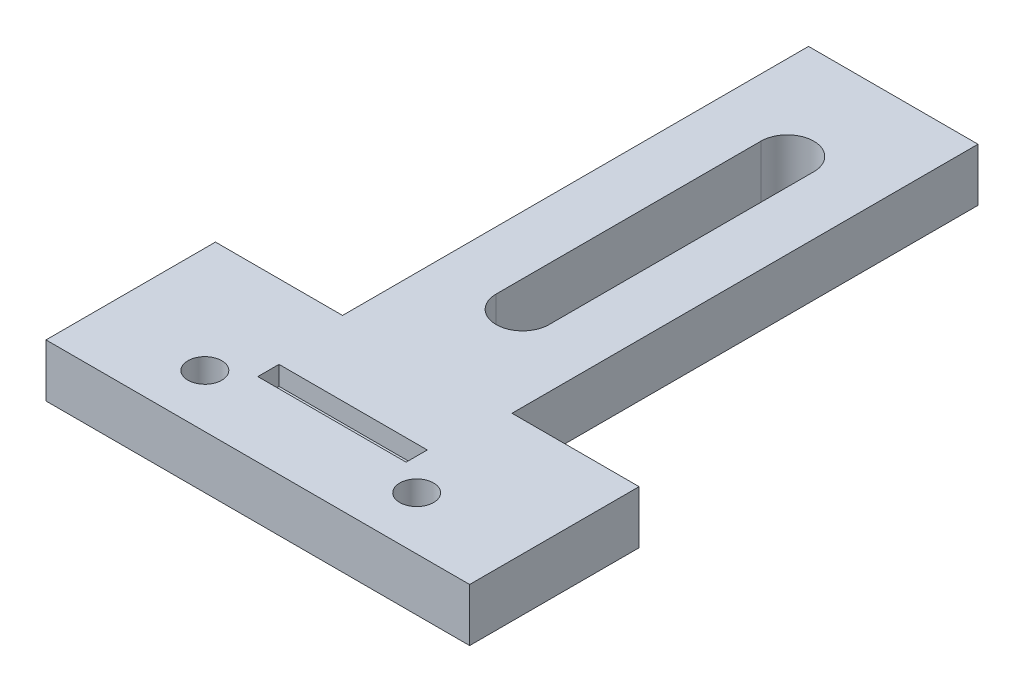
ISO-10303-21;
HEADER;
FILE_DESCRIPTION(('STEP AP214'),'2;1');
FILE_NAME('part.step','',(''),(''),'','','');
FILE_SCHEMA(('AUTOMOTIVE_DESIGN { 1 0 10303 214 1 1 1 1 }'));
ENDSEC;
DATA;
#1=APPLICATION_CONTEXT('core data for automotive mechanical design processes');
#2=APPLICATION_PROTOCOL_DEFINITION('international standard','automotive_design',2000,#1);
#3=PRODUCT_CONTEXT('',#1,'mechanical');
#4=PRODUCT('Part','Part','',(#3));
#5=PRODUCT_RELATED_PRODUCT_CATEGORY('part','',(#4));
#6=PRODUCT_DEFINITION_FORMATION('','',#4);
#7=PRODUCT_DEFINITION_CONTEXT('part definition',#1,'design');
#8=PRODUCT_DEFINITION('design','',#6,#7);
#9=PRODUCT_DEFINITION_SHAPE('','',#8);
#10=(LENGTH_UNIT() NAMED_UNIT(*) SI_UNIT(.MILLI.,.METRE.));
#11=(NAMED_UNIT(*) PLANE_ANGLE_UNIT() SI_UNIT($,.RADIAN.));
#12=(NAMED_UNIT(*) SI_UNIT($,.STERADIAN.) SOLID_ANGLE_UNIT());
#13=UNCERTAINTY_MEASURE_WITH_UNIT(LENGTH_MEASURE(1.E-05),#10,'distance_accuracy_value','');
#14=(GEOMETRIC_REPRESENTATION_CONTEXT(3) GLOBAL_UNCERTAINTY_ASSIGNED_CONTEXT((#13)) GLOBAL_UNIT_ASSIGNED_CONTEXT((#10,
#11,#12)) REPRESENTATION_CONTEXT('',''));
#15=CARTESIAN_POINT('',(0.,0.,0.));
#16=DIRECTION('',(0.,0.,1.));
#17=DIRECTION('',(1.,0.,0.));
#18=AXIS2_PLACEMENT_3D('',#15,#16,#17);
#19=CARTESIAN_POINT('',(0.,-5.,0.));
#20=DIRECTION('',(0.,1.,0.));
#21=DIRECTION('',(0.,0.,1.));
#22=AXIS2_PLACEMENT_3D('',#19,#20,#21);
#23=PLANE('',#22);
#24=DIRECTION('',(0.,0.,1.));
#25=VECTOR('',#24,1.);
#26=CARTESIAN_POINT('',(-20.,-5.,-16.));
#27=LINE('',#26,#25);
#28=CARTESIAN_POINT('',(-20.,-5.,-16.));
#29=VERTEX_POINT('',#28);
#30=CARTESIAN_POINT('',(-20.,-5.,0.));
#31=VERTEX_POINT('',#30);
#32=EDGE_CURVE('E262',#29,#31,#27,.T.);
#33=ORIENTED_EDGE('',*,*,#32,.F.);
#34=DIRECTION('',(-1.,0.,0.));
#35=VECTOR('',#34,1.);
#36=CARTESIAN_POINT('',(-20.,-5.,-16.));
#37=LINE('',#36,#35);
#38=CARTESIAN_POINT('',(-8.,-5.,-16.));
#39=VERTEX_POINT('',#38);
#40=EDGE_CURVE('E291',#39,#29,#37,.T.);
#41=ORIENTED_EDGE('',*,*,#40,.F.);
#42=DIRECTION('',(0.,0.,1.));
#43=VECTOR('',#42,1.);
#44=CARTESIAN_POINT('',(-8.,-5.,-16.));
#45=LINE('',#44,#43);
#46=CARTESIAN_POINT('',(-8.,-5.,-60.));
#47=VERTEX_POINT('',#46);
#48=EDGE_CURVE('E287',#47,#39,#45,.T.);
#49=ORIENTED_EDGE('',*,*,#48,.F.);
#50=DIRECTION('',(-1.,0.,0.));
#51=VECTOR('',#50,1.);
#52=CARTESIAN_POINT('',(-8.,-5.,-60.));
#53=LINE('',#52,#51);
#54=CARTESIAN_POINT('',(8.,-5.,-60.));
#55=VERTEX_POINT('',#54);
#56=EDGE_CURVE('E283',#55,#47,#53,.T.);
#57=ORIENTED_EDGE('',*,*,#56,.F.);
#58=DIRECTION('',(0.,0.,-1.));
#59=VECTOR('',#58,1.);
#60=CARTESIAN_POINT('',(8.,-5.,-60.));
#61=LINE('',#60,#59);
#62=CARTESIAN_POINT('',(8.00000000000001,-5.,-16.));
#63=VERTEX_POINT('',#62);
#64=EDGE_CURVE('E279',#63,#55,#61,.T.);
#65=ORIENTED_EDGE('',*,*,#64,.F.);
#66=DIRECTION('',(-1.,0.,0.));
#67=VECTOR('',#66,1.);
#68=CARTESIAN_POINT('',(8.00000000000001,-5.,-16.));
#69=LINE('',#68,#67);
#70=CARTESIAN_POINT('',(20.,-5.,-16.));
#71=VERTEX_POINT('',#70);
#72=EDGE_CURVE('E275',#71,#63,#69,.T.);
#73=ORIENTED_EDGE('',*,*,#72,.F.);
#74=DIRECTION('',(0.,0.,-1.));
#75=VECTOR('',#74,1.);
#76=CARTESIAN_POINT('',(20.,-5.,-16.));
#77=LINE('',#76,#75);
#78=CARTESIAN_POINT('',(20.,-5.,0.));
#79=VERTEX_POINT('',#78);
#80=EDGE_CURVE('E271',#79,#71,#77,.T.);
#81=ORIENTED_EDGE('',*,*,#80,.F.);
#82=DIRECTION('',(1.,0.,0.));
#83=VECTOR('',#82,1.);
#84=CARTESIAN_POINT('',(-20.,-5.,0.));
#85=LINE('',#84,#83);
#86=EDGE_CURVE('E266',#31,#79,#85,.T.);
#87=ORIENTED_EDGE('',*,*,#86,.F.);
#88=EDGE_LOOP('',(#33,#41,#49,#57,#65,#73,#81,#87));
#89=FACE_BOUND('',#88,.T.);
#90=CARTESIAN_POINT('',(-9.99999999999999,-5.,-4.99999999999999));
#91=DIRECTION('',(0.,1.,0.));
#92=DIRECTION('',(0.,0.,1.));
#93=AXIS2_PLACEMENT_3D('',#90,#91,#92);
#94=CIRCLE('',#93,1.6);
#95=CARTESIAN_POINT('',(-9.99999999999999,-5.,-3.39999999999999));
#96=VERTEX_POINT('',#95);
#97=EDGE_CURVE('E254',#96,#96,#94,.T.);
#98=ORIENTED_EDGE('',*,*,#97,.T.);
#99=EDGE_LOOP('',(#98));
#100=FACE_BOUND('',#99,.T.);
#101=CARTESIAN_POINT('',(10.,-5.,-5.));
#102=DIRECTION('',(0.,1.,0.));
#103=DIRECTION('',(0.,0.,1.));
#104=AXIS2_PLACEMENT_3D('',#101,#102,#103);
#105=CIRCLE('',#104,1.6);
#106=CARTESIAN_POINT('',(10.,-5.,-3.4));
#107=VERTEX_POINT('',#106);
#108=EDGE_CURVE('E246',#107,#107,#105,.T.);
#109=ORIENTED_EDGE('',*,*,#108,.T.);
#110=EDGE_LOOP('',(#109));
#111=FACE_BOUND('',#110,.T.);
#112=CARTESIAN_POINT('',(0.,-5.,-50.));
#113=DIRECTION('',(0.,1.,0.));
#114=DIRECTION('',(0.,0.,1.));
#115=AXIS2_PLACEMENT_3D('',#112,#113,#114);
#116=CIRCLE('',#115,2.5);
#117=CARTESIAN_POINT('',(2.5,-5.,-50.));
#118=VERTEX_POINT('',#117);
#119=CARTESIAN_POINT('',(-2.5,-5.,-50.));
#120=VERTEX_POINT('',#119);
#121=EDGE_CURVE('E65',#118,#120,#116,.T.);
#122=ORIENTED_EDGE('',*,*,#121,.T.);
#123=DIRECTION('',(0.,0.,1.));
#124=VECTOR('',#123,1.);
#125=CARTESIAN_POINT('',(-2.5,-5.,-50.));
#126=LINE('',#125,#124);
#127=CARTESIAN_POINT('',(-2.49999999999999,-5.,-25.));
#128=VERTEX_POINT('',#127);
#129=EDGE_CURVE('E223',#120,#128,#126,.T.);
#130=ORIENTED_EDGE('',*,*,#129,.T.);
#131=CARTESIAN_POINT('',(0.,-5.,-25.));
#132=DIRECTION('',(0.,1.,0.));
#133=DIRECTION('',(0.,0.,1.));
#134=AXIS2_PLACEMENT_3D('',#131,#132,#133);
#135=CIRCLE('',#134,2.5);
#136=CARTESIAN_POINT('',(2.5,-5.,-25.));
#137=VERTEX_POINT('',#136);
#138=EDGE_CURVE('E227',#128,#137,#135,.T.);
#139=ORIENTED_EDGE('',*,*,#138,.T.);
#140=DIRECTION('',(0.,0.,-1.));
#141=VECTOR('',#140,1.);
#142=CARTESIAN_POINT('',(2.5,-5.,-50.));
#143=LINE('',#142,#141);
#144=EDGE_CURVE('E210',#137,#118,#143,.T.);
#145=ORIENTED_EDGE('',*,*,#144,.T.);
#146=EDGE_LOOP('',(#122,#130,#139,#145));
#147=FACE_BOUND('',#146,.T.);
#148=ADVANCED_FACE('F39',(#89,#100,#111,#147),#23,.F.);
#149=CARTESIAN_POINT('',(0.,0.,0.));
#150=DIRECTION('',(0.,1.,0.));
#151=DIRECTION('',(0.,0.,1.));
#152=AXIS2_PLACEMENT_3D('',#149,#150,#151);
#153=PLANE('',#152);
#154=DIRECTION('',(0.,0.,1.));
#155=VECTOR('',#154,1.);
#156=CARTESIAN_POINT('',(-7.,0.,-8.99999999999999));
#157=LINE('',#156,#155);
#158=CARTESIAN_POINT('',(-7.,0.,-8.99999999999999));
#159=VERTEX_POINT('',#158);
#160=CARTESIAN_POINT('',(-7.,0.,-6.99999999999999));
#161=VERTEX_POINT('',#160);
#162=EDGE_CURVE('E57',#159,#161,#157,.T.);
#163=ORIENTED_EDGE('',*,*,#162,.F.);
#164=DIRECTION('',(-1.,0.,0.));
#165=VECTOR('',#164,1.);
#166=CARTESIAN_POINT('',(-7.,0.,-8.99999999999999));
#167=LINE('',#166,#165);
#168=CARTESIAN_POINT('',(7.,0.,-9.));
#169=VERTEX_POINT('',#168);
#170=EDGE_CURVE('E179',#169,#159,#167,.T.);
#171=ORIENTED_EDGE('',*,*,#170,.F.);
#172=DIRECTION('',(0.,0.,-1.));
#173=VECTOR('',#172,1.);
#174=CARTESIAN_POINT('',(7.,0.,-9.));
#175=LINE('',#174,#173);
#176=CARTESIAN_POINT('',(7.,0.,-7.));
#177=VERTEX_POINT('',#176);
#178=EDGE_CURVE('E183',#177,#169,#175,.T.);
#179=ORIENTED_EDGE('',*,*,#178,.F.);
#180=DIRECTION('',(1.,0.,0.));
#181=VECTOR('',#180,1.);
#182=CARTESIAN_POINT('',(-7.,0.,-6.99999999999999));
#183=LINE('',#182,#181);
#184=EDGE_CURVE('E192',#161,#177,#183,.T.);
#185=ORIENTED_EDGE('',*,*,#184,.F.);
#186=EDGE_LOOP('',(#163,#171,#179,#185));
#187=FACE_BOUND('',#186,.T.);
#188=CARTESIAN_POINT('',(10.,0.,-5.));
#189=DIRECTION('',(0.,1.,0.));
#190=DIRECTION('',(0.,0.,1.));
#191=AXIS2_PLACEMENT_3D('',#188,#189,#190);
#192=CIRCLE('',#191,1.6);
#193=CARTESIAN_POINT('',(10.,0.,-3.4));
#194=VERTEX_POINT('',#193);
#195=EDGE_CURVE('E245',#194,#194,#192,.T.);
#196=ORIENTED_EDGE('',*,*,#195,.F.);
#197=EDGE_LOOP('',(#196));
#198=FACE_BOUND('',#197,.T.);
#199=CARTESIAN_POINT('',(-9.99999999999999,0.,-4.99999999999999));
#200=DIRECTION('',(0.,1.,0.));
#201=DIRECTION('',(0.,0.,1.));
#202=AXIS2_PLACEMENT_3D('',#199,#200,#201);
#203=CIRCLE('',#202,1.6);
#204=CARTESIAN_POINT('',(-9.99999999999999,0.,-3.39999999999999));
#205=VERTEX_POINT('',#204);
#206=EDGE_CURVE('E250',#205,#205,#203,.T.);
#207=ORIENTED_EDGE('',*,*,#206,.F.);
#208=EDGE_LOOP('',(#207));
#209=FACE_BOUND('',#208,.T.);
#210=DIRECTION('',(0.,0.,1.));
#211=VECTOR('',#210,1.);
#212=CARTESIAN_POINT('',(-20.,0.,-16.));
#213=LINE('',#212,#211);
#214=CARTESIAN_POINT('',(-20.,0.,-16.));
#215=VERTEX_POINT('',#214);
#216=CARTESIAN_POINT('',(-20.,0.,0.));
#217=VERTEX_POINT('',#216);
#218=EDGE_CURVE('E258',#215,#217,#213,.T.);
#219=ORIENTED_EDGE('',*,*,#218,.T.);
#220=DIRECTION('',(1.,0.,0.));
#221=VECTOR('',#220,1.);
#222=CARTESIAN_POINT('',(-20.,0.,0.));
#223=LINE('',#222,#221);
#224=CARTESIAN_POINT('',(20.,0.,0.));
#225=VERTEX_POINT('',#224);
#226=EDGE_CURVE('E298',#217,#225,#223,.T.);
#227=ORIENTED_EDGE('',*,*,#226,.T.);
#228=DIRECTION('',(0.,0.,-1.));
#229=VECTOR('',#228,1.);
#230=CARTESIAN_POINT('',(20.,0.,-16.));
#231=LINE('',#230,#229);
#232=CARTESIAN_POINT('',(20.,0.,-16.));
#233=VERTEX_POINT('',#232);
#234=EDGE_CURVE('E302',#225,#233,#231,.T.);
#235=ORIENTED_EDGE('',*,*,#234,.T.);
#236=DIRECTION('',(-1.,0.,0.));
#237=VECTOR('',#236,1.);
#238=CARTESIAN_POINT('',(8.00000000000001,0.,-16.));
#239=LINE('',#238,#237);
#240=CARTESIAN_POINT('',(8.00000000000001,0.,-16.));
#241=VERTEX_POINT('',#240);
#242=EDGE_CURVE('E306',#233,#241,#239,.T.);
#243=ORIENTED_EDGE('',*,*,#242,.T.);
#244=DIRECTION('',(0.,0.,-1.));
#245=VECTOR('',#244,1.);
#246=CARTESIAN_POINT('',(8.,0.,-60.));
#247=LINE('',#246,#245);
#248=CARTESIAN_POINT('',(8.,0.,-60.));
#249=VERTEX_POINT('',#248);
#250=EDGE_CURVE('E310',#241,#249,#247,.T.);
#251=ORIENTED_EDGE('',*,*,#250,.T.);
#252=DIRECTION('',(-1.,0.,0.));
#253=VECTOR('',#252,1.);
#254=CARTESIAN_POINT('',(-8.,0.,-60.));
#255=LINE('',#254,#253);
#256=CARTESIAN_POINT('',(-8.,0.,-60.));
#257=VERTEX_POINT('',#256);
#258=EDGE_CURVE('E314',#249,#257,#255,.T.);
#259=ORIENTED_EDGE('',*,*,#258,.T.);
#260=DIRECTION('',(0.,0.,1.));
#261=VECTOR('',#260,1.);
#262=CARTESIAN_POINT('',(-8.,0.,-16.));
#263=LINE('',#262,#261);
#264=CARTESIAN_POINT('',(-8.,0.,-16.));
#265=VERTEX_POINT('',#264);
#266=EDGE_CURVE('E318',#257,#265,#263,.T.);
#267=ORIENTED_EDGE('',*,*,#266,.T.);
#268=DIRECTION('',(-1.,0.,0.));
#269=VECTOR('',#268,1.);
#270=CARTESIAN_POINT('',(-20.,0.,-16.));
#271=LINE('',#270,#269);
#272=EDGE_CURVE('E267',#265,#215,#271,.T.);
#273=ORIENTED_EDGE('',*,*,#272,.T.);
#274=EDGE_LOOP('',(#219,#227,#235,#243,#251,#259,#267,#273));
#275=FACE_BOUND('',#274,.T.);
#276=DIRECTION('',(0.,0.,1.));
#277=VECTOR('',#276,1.);
#278=CARTESIAN_POINT('',(-2.5,0.,-50.));
#279=LINE('',#278,#277);
#280=CARTESIAN_POINT('',(-2.5,0.,-50.));
#281=VERTEX_POINT('',#280);
#282=CARTESIAN_POINT('',(-2.49999999999999,0.,-25.));
#283=VERTEX_POINT('',#282);
#284=EDGE_CURVE('E209',#281,#283,#279,.T.);
#285=ORIENTED_EDGE('',*,*,#284,.F.);
#286=CARTESIAN_POINT('',(0.,0.,-50.));
#287=DIRECTION('',(0.,1.,0.));
#288=DIRECTION('',(0.,0.,1.));
#289=AXIS2_PLACEMENT_3D('',#286,#287,#288);
#290=CIRCLE('',#289,2.5);
#291=CARTESIAN_POINT('',(2.5,0.,-50.));
#292=VERTEX_POINT('',#291);
#293=EDGE_CURVE('E206',#292,#281,#290,.T.);
#294=ORIENTED_EDGE('',*,*,#293,.F.);
#295=DIRECTION('',(0.,0.,-1.));
#296=VECTOR('',#295,1.);
#297=CARTESIAN_POINT('',(2.5,0.,-50.));
#298=LINE('',#297,#296);
#299=CARTESIAN_POINT('',(2.5,0.,-25.));
#300=VERTEX_POINT('',#299);
#301=EDGE_CURVE('E217',#300,#292,#298,.T.);
#302=ORIENTED_EDGE('',*,*,#301,.F.);
#303=CARTESIAN_POINT('',(0.,0.,-25.));
#304=DIRECTION('',(0.,1.,0.));
#305=DIRECTION('',(0.,0.,1.));
#306=AXIS2_PLACEMENT_3D('',#303,#304,#305);
#307=CIRCLE('',#306,2.5);
#308=EDGE_CURVE('E213',#283,#300,#307,.T.);
#309=ORIENTED_EDGE('',*,*,#308,.F.);
#310=EDGE_LOOP('',(#285,#294,#302,#309));
#311=FACE_BOUND('',#310,.T.);
#312=ADVANCED_FACE('F350',(#187,#198,#209,#275,#311),#153,.T.);
#313=CARTESIAN_POINT('',(-20.,-5.,-16.));
#314=DIRECTION('',(-1.,0.,0.));
#315=DIRECTION('',(0.,0.,1.));
#316=AXIS2_PLACEMENT_3D('',#313,#314,#315);
#317=PLANE('',#316);
#318=ORIENTED_EDGE('',*,*,#218,.F.);
#319=DIRECTION('',(0.,1.,0.));
#320=VECTOR('',#319,1.);
#321=CARTESIAN_POINT('',(-20.,-5.,-16.));
#322=LINE('',#321,#320);
#323=EDGE_CURVE('E11',#29,#215,#322,.T.);
#324=ORIENTED_EDGE('',*,*,#323,.F.);
#325=ORIENTED_EDGE('',*,*,#32,.T.);
#326=DIRECTION('',(0.,1.,0.));
#327=VECTOR('',#326,1.);
#328=CARTESIAN_POINT('',(-20.,-5.,0.));
#329=LINE('',#328,#327);
#330=EDGE_CURVE('E43',#31,#217,#329,.T.);
#331=ORIENTED_EDGE('',*,*,#330,.T.);
#332=EDGE_LOOP('',(#318,#324,#325,#331));
#333=FACE_BOUND('',#332,.T.);
#334=ADVANCED_FACE('F41',(#333),#317,.T.);
#335=CARTESIAN_POINT('',(-20.,-5.,-16.));
#336=DIRECTION('',(0.,0.,-1.));
#337=DIRECTION('',(-1.,0.,0.));
#338=AXIS2_PLACEMENT_3D('',#335,#336,#337);
#339=PLANE('',#338);
#340=ORIENTED_EDGE('',*,*,#272,.F.);
#341=DIRECTION('',(0.,1.,0.));
#342=VECTOR('',#341,1.);
#343=CARTESIAN_POINT('',(-8.,-5.,-16.));
#344=LINE('',#343,#342);
#345=EDGE_CURVE('E49',#39,#265,#344,.T.);
#346=ORIENTED_EDGE('',*,*,#345,.F.);
#347=ORIENTED_EDGE('',*,*,#40,.T.);
#348=ORIENTED_EDGE('',*,*,#323,.T.);
#349=EDGE_LOOP('',(#340,#346,#347,#348));
#350=FACE_BOUND('',#349,.T.);
#351=ADVANCED_FACE('F355',(#350),#339,.T.);
#352=CARTESIAN_POINT('',(-8.,-5.,-16.));
#353=DIRECTION('',(-1.,0.,0.));
#354=DIRECTION('',(0.,0.,1.));
#355=AXIS2_PLACEMENT_3D('',#352,#353,#354);
#356=PLANE('',#355);
#357=ORIENTED_EDGE('',*,*,#266,.F.);
#358=DIRECTION('',(0.,1.,0.));
#359=VECTOR('',#358,1.);
#360=CARTESIAN_POINT('',(-8.,-5.,-60.));
#361=LINE('',#360,#359);
#362=EDGE_CURVE('E327',#47,#257,#361,.T.);
#363=ORIENTED_EDGE('',*,*,#362,.F.);
#364=ORIENTED_EDGE('',*,*,#48,.T.);
#365=ORIENTED_EDGE('',*,*,#345,.T.);
#366=EDGE_LOOP('',(#357,#363,#364,#365));
#367=FACE_BOUND('',#366,.T.);
#368=ADVANCED_FACE('F376',(#367),#356,.T.);
#369=CARTESIAN_POINT('',(-8.,-5.,-60.));
#370=DIRECTION('',(0.,0.,-1.));
#371=DIRECTION('',(-1.,0.,0.));
#372=AXIS2_PLACEMENT_3D('',#369,#370,#371);
#373=PLANE('',#372);
#374=ORIENTED_EDGE('',*,*,#258,.F.);
#375=DIRECTION('',(0.,1.,0.));
#376=VECTOR('',#375,1.);
#377=CARTESIAN_POINT('',(8.,-5.,-60.));
#378=LINE('',#377,#376);
#379=EDGE_CURVE('E330',#55,#249,#378,.T.);
#380=ORIENTED_EDGE('',*,*,#379,.F.);
#381=ORIENTED_EDGE('',*,*,#56,.T.);
#382=ORIENTED_EDGE('',*,*,#362,.T.);
#383=EDGE_LOOP('',(#374,#380,#381,#382));
#384=FACE_BOUND('',#383,.T.);
#385=ADVANCED_FACE('F374',(#384),#373,.T.);
#386=CARTESIAN_POINT('',(8.,-5.,-60.));
#387=DIRECTION('',(1.,0.,0.));
#388=DIRECTION('',(0.,0.,-1.));
#389=AXIS2_PLACEMENT_3D('',#386,#387,#388);
#390=PLANE('',#389);
#391=ORIENTED_EDGE('',*,*,#250,.F.);
#392=DIRECTION('',(0.,1.,0.));
#393=VECTOR('',#392,1.);
#394=CARTESIAN_POINT('',(8.00000000000001,-5.,-16.));
#395=LINE('',#394,#393);
#396=EDGE_CURVE('E333',#63,#241,#395,.T.);
#397=ORIENTED_EDGE('',*,*,#396,.F.);
#398=ORIENTED_EDGE('',*,*,#64,.T.);
#399=ORIENTED_EDGE('',*,*,#379,.T.);
#400=EDGE_LOOP('',(#391,#397,#398,#399));
#401=FACE_BOUND('',#400,.T.);
#402=ADVANCED_FACE('F370',(#401),#390,.T.);
#403=CARTESIAN_POINT('',(8.00000000000001,-5.,-16.));
#404=DIRECTION('',(0.,0.,-1.));
#405=DIRECTION('',(-1.,0.,0.));
#406=AXIS2_PLACEMENT_3D('',#403,#404,#405);
#407=PLANE('',#406);
#408=ORIENTED_EDGE('',*,*,#242,.F.);
#409=DIRECTION('',(0.,1.,0.));
#410=VECTOR('',#409,1.);
#411=CARTESIAN_POINT('',(20.,-5.,-16.));
#412=LINE('',#411,#410);
#413=EDGE_CURVE('E336',#71,#233,#412,.T.);
#414=ORIENTED_EDGE('',*,*,#413,.F.);
#415=ORIENTED_EDGE('',*,*,#72,.T.);
#416=ORIENTED_EDGE('',*,*,#396,.T.);
#417=EDGE_LOOP('',(#408,#414,#415,#416));
#418=FACE_BOUND('',#417,.T.);
#419=ADVANCED_FACE('F368',(#418),#407,.T.);
#420=CARTESIAN_POINT('',(20.,-5.,-16.));
#421=DIRECTION('',(1.,0.,0.));
#422=DIRECTION('',(0.,0.,-1.));
#423=AXIS2_PLACEMENT_3D('',#420,#421,#422);
#424=PLANE('',#423);
#425=ORIENTED_EDGE('',*,*,#234,.F.);
#426=DIRECTION('',(0.,1.,0.));
#427=VECTOR('',#426,1.);
#428=CARTESIAN_POINT('',(20.,-5.,0.));
#429=LINE('',#428,#427);
#430=EDGE_CURVE('E338',#79,#225,#429,.T.);
#431=ORIENTED_EDGE('',*,*,#430,.F.);
#432=ORIENTED_EDGE('',*,*,#80,.T.);
#433=ORIENTED_EDGE('',*,*,#413,.T.);
#434=EDGE_LOOP('',(#425,#431,#432,#433));
#435=FACE_BOUND('',#434,.T.);
#436=ADVANCED_FACE('F364',(#435),#424,.T.);
#437=CARTESIAN_POINT('',(-20.,-5.,0.));
#438=DIRECTION('',(0.,0.,1.));
#439=DIRECTION('',(1.,0.,0.));
#440=AXIS2_PLACEMENT_3D('',#437,#438,#439);
#441=PLANE('',#440);
#442=ORIENTED_EDGE('',*,*,#226,.F.);
#443=ORIENTED_EDGE('',*,*,#330,.F.);
#444=ORIENTED_EDGE('',*,*,#86,.T.);
#445=ORIENTED_EDGE('',*,*,#430,.T.);
#446=EDGE_LOOP('',(#442,#443,#444,#445));
#447=FACE_BOUND('',#446,.T.);
#448=ADVANCED_FACE('F348',(#447),#441,.T.);
#449=CARTESIAN_POINT('',(-9.99999999999999,-5.,-4.99999999999999));
#450=DIRECTION('',(0.,1.,0.));
#451=DIRECTION('',(0.,0.,1.));
#452=AXIS2_PLACEMENT_3D('',#449,#450,#451);
#453=CYLINDRICAL_SURFACE('',#452,1.6);
#454=ORIENTED_EDGE('',*,*,#97,.F.);
#455=EDGE_LOOP('',(#454));
#456=FACE_BOUND('',#455,.T.);
#457=ORIENTED_EDGE('',*,*,#206,.T.);
#458=EDGE_LOOP('',(#457));
#459=FACE_BOUND('',#458,.T.);
#460=ADVANCED_FACE('F393',(#456,#459),#453,.F.);
#461=CARTESIAN_POINT('',(10.,-5.,-5.));
#462=DIRECTION('',(0.,1.,0.));
#463=DIRECTION('',(0.,0.,1.));
#464=AXIS2_PLACEMENT_3D('',#461,#462,#463);
#465=CYLINDRICAL_SURFACE('',#464,1.6);
#466=ORIENTED_EDGE('',*,*,#108,.F.);
#467=EDGE_LOOP('',(#466));
#468=FACE_BOUND('',#467,.T.);
#469=ORIENTED_EDGE('',*,*,#195,.T.);
#470=EDGE_LOOP('',(#469));
#471=FACE_BOUND('',#470,.T.);
#472=ADVANCED_FACE('F396',(#468,#471),#465,.F.);
#473=CARTESIAN_POINT('',(0.,0.,-50.));
#474=DIRECTION('',(0.,-1.,0.));
#475=DIRECTION('',(0.,0.,-1.));
#476=AXIS2_PLACEMENT_3D('',#473,#474,#475);
#477=CYLINDRICAL_SURFACE('',#476,2.5);
#478=ORIENTED_EDGE('',*,*,#121,.F.);
#479=DIRECTION('',(0.,-1.,0.));
#480=VECTOR('',#479,1.);
#481=CARTESIAN_POINT('',(2.5,0.,-50.));
#482=LINE('',#481,#480);
#483=EDGE_CURVE('E220',#292,#118,#482,.T.);
#484=ORIENTED_EDGE('',*,*,#483,.F.);
#485=ORIENTED_EDGE('',*,*,#293,.T.);
#486=DIRECTION('',(0.,-1.,0.));
#487=VECTOR('',#486,1.);
#488=CARTESIAN_POINT('',(-2.5,0.,-50.));
#489=LINE('',#488,#487);
#490=EDGE_CURVE('E242',#281,#120,#489,.T.);
#491=ORIENTED_EDGE('',*,*,#490,.T.);
#492=EDGE_LOOP('',(#478,#484,#485,#491));
#493=FACE_BOUND('',#492,.T.);
#494=ADVANCED_FACE('F400',(#493),#477,.F.);
#495=CARTESIAN_POINT('',(-2.5,0.,-50.));
#496=DIRECTION('',(1.,0.,0.));
#497=DIRECTION('',(0.,0.,-1.));
#498=AXIS2_PLACEMENT_3D('',#495,#496,#497);
#499=PLANE('',#498);
#500=ORIENTED_EDGE('',*,*,#129,.F.);
#501=ORIENTED_EDGE('',*,*,#490,.F.);
#502=ORIENTED_EDGE('',*,*,#284,.T.);
#503=DIRECTION('',(0.,-1.,0.));
#504=VECTOR('',#503,1.);
#505=CARTESIAN_POINT('',(-2.49999999999999,0.,-25.));
#506=LINE('',#505,#504);
#507=EDGE_CURVE('E239',#283,#128,#506,.T.);
#508=ORIENTED_EDGE('',*,*,#507,.T.);
#509=EDGE_LOOP('',(#500,#501,#502,#508));
#510=FACE_BOUND('',#509,.T.);
#511=ADVANCED_FACE('F404',(#510),#499,.T.);
#512=CARTESIAN_POINT('',(0.,0.,-25.));
#513=DIRECTION('',(0.,-1.,0.));
#514=DIRECTION('',(0.,0.,-1.));
#515=AXIS2_PLACEMENT_3D('',#512,#513,#514);
#516=CYLINDRICAL_SURFACE('',#515,2.5);
#517=ORIENTED_EDGE('',*,*,#138,.F.);
#518=ORIENTED_EDGE('',*,*,#507,.F.);
#519=ORIENTED_EDGE('',*,*,#308,.T.);
#520=DIRECTION('',(0.,-1.,0.));
#521=VECTOR('',#520,1.);
#522=CARTESIAN_POINT('',(2.5,0.,-25.));
#523=LINE('',#522,#521);
#524=EDGE_CURVE('E236',#300,#137,#523,.T.);
#525=ORIENTED_EDGE('',*,*,#524,.T.);
#526=EDGE_LOOP('',(#517,#518,#519,#525));
#527=FACE_BOUND('',#526,.T.);
#528=ADVANCED_FACE('F407',(#527),#516,.F.);
#529=CARTESIAN_POINT('',(2.5,0.,-50.));
#530=DIRECTION('',(-1.,0.,0.));
#531=DIRECTION('',(0.,0.,1.));
#532=AXIS2_PLACEMENT_3D('',#529,#530,#531);
#533=PLANE('',#532);
#534=ORIENTED_EDGE('',*,*,#144,.F.);
#535=ORIENTED_EDGE('',*,*,#524,.F.);
#536=ORIENTED_EDGE('',*,*,#301,.T.);
#537=ORIENTED_EDGE('',*,*,#483,.T.);
#538=EDGE_LOOP('',(#534,#535,#536,#537));
#539=FACE_BOUND('',#538,.T.);
#540=ADVANCED_FACE('F411',(#539),#533,.T.);
#541=CARTESIAN_POINT('',(-7.,-1.8,-8.99999999999999));
#542=DIRECTION('',(-1.,0.,0.));
#543=DIRECTION('',(0.,0.,1.));
#544=AXIS2_PLACEMENT_3D('',#541,#542,#543);
#545=PLANE('',#544);
#546=ORIENTED_EDGE('',*,*,#162,.T.);
#547=DIRECTION('',(0.,1.,0.));
#548=VECTOR('',#547,1.);
#549=CARTESIAN_POINT('',(-7.,-1.8,-6.99999999999999));
#550=LINE('',#549,#548);
#551=CARTESIAN_POINT('',(-7.,-1.8,-6.99999999999999));
#552=VERTEX_POINT('',#551);
#553=EDGE_CURVE('E154',#552,#161,#550,.T.);
#554=ORIENTED_EDGE('',*,*,#553,.F.);
#555=DIRECTION('',(0.,0.,1.));
#556=VECTOR('',#555,1.);
#557=CARTESIAN_POINT('',(-7.,-1.8,-8.99999999999999));
#558=LINE('',#557,#556);
#559=CARTESIAN_POINT('',(-7.,-1.8,-8.99999999999999));
#560=VERTEX_POINT('',#559);
#561=EDGE_CURVE('E158',#560,#552,#558,.T.);
#562=ORIENTED_EDGE('',*,*,#561,.F.);
#563=DIRECTION('',(0.,1.,0.));
#564=VECTOR('',#563,1.);
#565=CARTESIAN_POINT('',(-7.,-1.8,-8.99999999999999));
#566=LINE('',#565,#564);
#567=EDGE_CURVE('E198',#560,#159,#566,.T.);
#568=ORIENTED_EDGE('',*,*,#567,.T.);
#569=EDGE_LOOP('',(#546,#554,#562,#568));
#570=FACE_BOUND('',#569,.T.);
#571=ADVANCED_FACE('F156',(#570),#545,.F.);
#572=CARTESIAN_POINT('',(-7.,-1.8,-8.99999999999999));
#573=DIRECTION('',(0.,0.,-1.));
#574=DIRECTION('',(-1.,0.,0.));
#575=AXIS2_PLACEMENT_3D('',#572,#573,#574);
#576=PLANE('',#575);
#577=ORIENTED_EDGE('',*,*,#170,.T.);
#578=ORIENTED_EDGE('',*,*,#567,.F.);
#579=DIRECTION('',(-1.,0.,0.));
#580=VECTOR('',#579,1.);
#581=CARTESIAN_POINT('',(-7.,-1.8,-8.99999999999999));
#582=LINE('',#581,#580);
#583=CARTESIAN_POINT('',(7.,-1.8,-9.));
#584=VERTEX_POINT('',#583);
#585=EDGE_CURVE('E165',#584,#560,#582,.T.);
#586=ORIENTED_EDGE('',*,*,#585,.F.);
#587=DIRECTION('',(0.,1.,0.));
#588=VECTOR('',#587,1.);
#589=CARTESIAN_POINT('',(7.,-1.8,-9.));
#590=LINE('',#589,#588);
#591=EDGE_CURVE('E201',#584,#169,#590,.T.);
#592=ORIENTED_EDGE('',*,*,#591,.T.);
#593=EDGE_LOOP('',(#577,#578,#586,#592));
#594=FACE_BOUND('',#593,.T.);
#595=ADVANCED_FACE('F418',(#594),#576,.F.);
#596=CARTESIAN_POINT('',(7.,-1.8,-9.));
#597=DIRECTION('',(1.,0.,0.));
#598=DIRECTION('',(0.,0.,-1.));
#599=AXIS2_PLACEMENT_3D('',#596,#597,#598);
#600=PLANE('',#599);
#601=ORIENTED_EDGE('',*,*,#178,.T.);
#602=ORIENTED_EDGE('',*,*,#591,.F.);
#603=DIRECTION('',(0.,0.,-1.));
#604=VECTOR('',#603,1.);
#605=CARTESIAN_POINT('',(7.,-1.8,-9.));
#606=LINE('',#605,#604);
#607=CARTESIAN_POINT('',(7.,-1.8,-7.));
#608=VERTEX_POINT('',#607);
#609=EDGE_CURVE('E174',#608,#584,#606,.T.);
#610=ORIENTED_EDGE('',*,*,#609,.F.);
#611=DIRECTION('',(0.,1.,0.));
#612=VECTOR('',#611,1.);
#613=CARTESIAN_POINT('',(7.,-1.8,-7.));
#614=LINE('',#613,#612);
#615=EDGE_CURVE('E164',#608,#177,#614,.T.);
#616=ORIENTED_EDGE('',*,*,#615,.T.);
#617=EDGE_LOOP('',(#601,#602,#610,#616));
#618=FACE_BOUND('',#617,.T.);
#619=ADVANCED_FACE('F421',(#618),#600,.F.);
#620=CARTESIAN_POINT('',(-7.,-1.8,-6.99999999999999));
#621=DIRECTION('',(0.,0.,1.));
#622=DIRECTION('',(1.,0.,0.));
#623=AXIS2_PLACEMENT_3D('',#620,#621,#622);
#624=PLANE('',#623);
#625=ORIENTED_EDGE('',*,*,#184,.T.);
#626=ORIENTED_EDGE('',*,*,#615,.F.);
#627=DIRECTION('',(1.,0.,0.));
#628=VECTOR('',#627,1.);
#629=CARTESIAN_POINT('',(-7.,-1.8,-6.99999999999999));
#630=LINE('',#629,#628);
#631=EDGE_CURVE('E168',#552,#608,#630,.T.);
#632=ORIENTED_EDGE('',*,*,#631,.F.);
#633=ORIENTED_EDGE('',*,*,#553,.T.);
#634=EDGE_LOOP('',(#625,#626,#632,#633));
#635=FACE_BOUND('',#634,.T.);
#636=ADVANCED_FACE('F169',(#635),#624,.F.);
#637=CARTESIAN_POINT('',(0.,-1.8,0.));
#638=DIRECTION('',(0.,1.,0.));
#639=DIRECTION('',(0.,0.,1.));
#640=AXIS2_PLACEMENT_3D('',#637,#638,#639);
#641=PLANE('',#640);
#642=ORIENTED_EDGE('',*,*,#561,.T.);
#643=ORIENTED_EDGE('',*,*,#631,.T.);
#644=ORIENTED_EDGE('',*,*,#609,.T.);
#645=ORIENTED_EDGE('',*,*,#585,.T.);
#646=EDGE_LOOP('',(#642,#643,#644,#645));
#647=FACE_BOUND('',#646,.T.);
#648=ADVANCED_FACE('F176',(#647),#641,.T.);
#649=CLOSED_SHELL('',(#148,#312,#334,#351,#368,#385,#402,#419,#436,#448,#460,#472,#494,#511,
#528,#540,#571,#595,#619,#636,#648));
#650=MANIFOLD_SOLID_BREP('B2',#649);
#651=ADVANCED_BREP_SHAPE_REPRESENTATION('',(#18,#650),#14);
#652=SHAPE_DEFINITION_REPRESENTATION(#9,#651);
ENDSEC;
END-ISO-10303-21;
